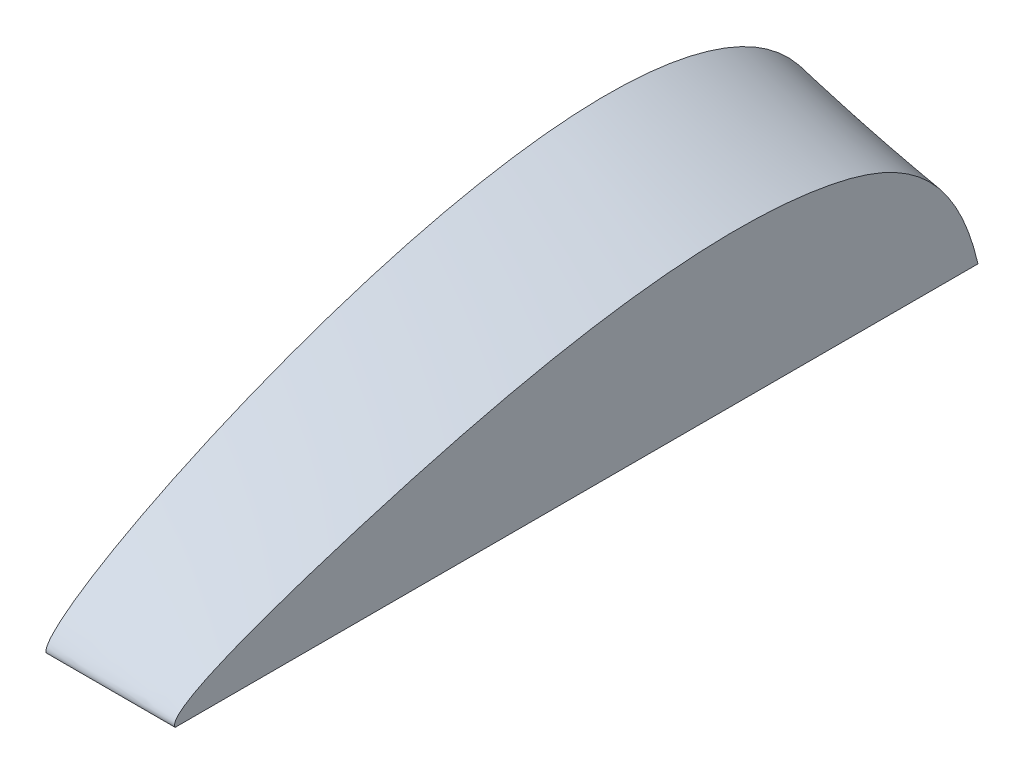
ISO-10303-21;
HEADER;
FILE_DESCRIPTION(('STEP AP214'),'2;1');
FILE_NAME('part.step','',(''),(''),'','','');
FILE_SCHEMA(('AUTOMOTIVE_DESIGN { 1 0 10303 214 1 1 1 1 }'));
ENDSEC;
DATA;
#1=APPLICATION_CONTEXT('core data for automotive mechanical design processes');
#2=APPLICATION_PROTOCOL_DEFINITION('international standard','automotive_design',2000,#1);
#3=PRODUCT_CONTEXT('',#1,'mechanical');
#4=PRODUCT('Part','Part','',(#3));
#5=PRODUCT_RELATED_PRODUCT_CATEGORY('part','',(#4));
#6=PRODUCT_DEFINITION_FORMATION('','',#4);
#7=PRODUCT_DEFINITION_CONTEXT('part definition',#1,'design');
#8=PRODUCT_DEFINITION('design','',#6,#7);
#9=PRODUCT_DEFINITION_SHAPE('','',#8);
#10=(LENGTH_UNIT() NAMED_UNIT(*) SI_UNIT(.MILLI.,.METRE.));
#11=(NAMED_UNIT(*) PLANE_ANGLE_UNIT() SI_UNIT($,.RADIAN.));
#12=(NAMED_UNIT(*) SI_UNIT($,.STERADIAN.) SOLID_ANGLE_UNIT());
#13=UNCERTAINTY_MEASURE_WITH_UNIT(LENGTH_MEASURE(1.E-05),#10,'distance_accuracy_value','');
#14=(GEOMETRIC_REPRESENTATION_CONTEXT(3) GLOBAL_UNCERTAINTY_ASSIGNED_CONTEXT((#13)) GLOBAL_UNIT_ASSIGNED_CONTEXT((#10,
#11,#12)) REPRESENTATION_CONTEXT('',''));
#15=CARTESIAN_POINT('',(0.,0.,0.));
#16=DIRECTION('',(0.,0.,1.));
#17=DIRECTION('',(1.,0.,0.));
#18=AXIS2_PLACEMENT_3D('',#15,#16,#17);
#19=CARTESIAN_POINT('',(45.72,45.4918064139461,11.6264584789723));
#20=DIRECTION('',(1.,0.,0.));
#21=DIRECTION('',(0.,0.,-1.));
#22=AXIS2_PLACEMENT_3D('',#19,#20,#21);
#23=PLANE('',#22);
#24=CARTESIAN_POINT('',(45.72,-3.57791435599524E-13,-142.24));
#25=CARTESIAN_POINT('',(45.72,35.6850060442603,-133.930047255575));
#26=CARTESIAN_POINT('',(45.72,67.099162145114,-72.1826211504353));
#27=CARTESIAN_POINT('',(45.72,33.3645987338918,72.0438580607478));
#28=CARTESIAN_POINT('',(45.72,5.74057061929836,145.252976531255));
#29=CARTESIAN_POINT('',(45.72,0.,142.24));
#30=B_SPLINE_CURVE_WITH_KNOTS('',3,(#24,#25,#26,#27,#28,#29),.UNSPECIFIED.,.F.,.F.,(4,1,1,4),
(0.,0.230277741661509,0.675748620710176,1.),.UNSPECIFIED.);
#31=CARTESIAN_POINT('',(45.72,0.,-142.24));
#32=VERTEX_POINT('',#31);
#33=CARTESIAN_POINT('',(45.72,0.,142.24));
#34=VERTEX_POINT('',#33);
#35=EDGE_CURVE('E44',#32,#34,#30,.T.);
#36=ORIENTED_EDGE('',*,*,#35,.T.);
#37=DIRECTION('',(0.,0.,-1.));
#38=VECTOR('',#37,1.);
#39=CARTESIAN_POINT('',(45.72,0.,142.24));
#40=LINE('',#39,#38);
#41=EDGE_CURVE('E11',#34,#32,#40,.T.);
#42=ORIENTED_EDGE('',*,*,#41,.T.);
#43=EDGE_LOOP('',(#36,#42));
#44=FACE_BOUND('',#43,.T.);
#45=ADVANCED_FACE('F41',(#44),#23,.T.);
#46=CARTESIAN_POINT('',(0.,63.0818745722551,7.9557463435145));
#47=DIRECTION('',(1.,0.,0.));
#48=DIRECTION('',(0.,0.,-1.));
#49=AXIS2_PLACEMENT_3D('',#46,#47,#48);
#50=PLANE('',#49);
#51=CARTESIAN_POINT('',(0.,-2.01841663950931E-13,-142.24));
#52=CARTESIAN_POINT('',(0.,38.6901289092014,-136.736962369235));
#53=CARTESIAN_POINT('',(0.,119.075313211528,-66.6053121241711));
#54=CARTESIAN_POINT('',(0.,14.1329786971291,145.7744150032));
#55=CARTESIAN_POINT('',(0.,0.,142.24));
#56=B_SPLINE_CURVE_WITH_KNOTS('',3,(#51,#52,#53,#54,#55),.UNSPECIFIED.,.F.,.F.,(4,1,4),(0.,
0.218953457440848,1.),.UNSPECIFIED.);
#57=CARTESIAN_POINT('',(0.,0.,-142.24));
#58=VERTEX_POINT('',#57);
#59=CARTESIAN_POINT('',(0.,0.,142.24));
#60=VERTEX_POINT('',#59);
#61=EDGE_CURVE('E72',#58,#60,#56,.T.);
#62=ORIENTED_EDGE('',*,*,#61,.F.);
#63=DIRECTION('',(0.,0.,-1.));
#64=VECTOR('',#63,1.);
#65=CARTESIAN_POINT('',(0.,0.,142.24));
#66=LINE('',#65,#64);
#67=EDGE_CURVE('E70',#60,#58,#66,.T.);
#68=ORIENTED_EDGE('',*,*,#67,.F.);
#69=EDGE_LOOP('',(#62,#68));
#70=FACE_BOUND('',#69,.T.);
#71=ADVANCED_FACE('F71',(#70),#50,.F.);
#72=CARTESIAN_POINT('',(0.,0.,0.));
#73=DIRECTION('',(0.,1.,0.));
#74=DIRECTION('',(0.,0.,1.));
#75=AXIS2_PLACEMENT_3D('',#72,#73,#74);
#76=PLANE('',#75);
#77=DIRECTION('',(1.,0.,0.));
#78=VECTOR('',#77,1.);
#79=CARTESIAN_POINT('',(0.,0.,-142.24));
#80=LINE('',#79,#78);
#81=EDGE_CURVE('E77',#58,#32,#80,.T.);
#82=ORIENTED_EDGE('',*,*,#81,.T.);
#83=ORIENTED_EDGE('',*,*,#41,.F.);
#84=DIRECTION('',(1.,0.,0.));
#85=VECTOR('',#84,1.);
#86=CARTESIAN_POINT('',(0.,0.,142.24));
#87=LINE('',#86,#85);
#88=EDGE_CURVE('E62',#60,#34,#87,.T.);
#89=ORIENTED_EDGE('',*,*,#88,.F.);
#90=ORIENTED_EDGE('',*,*,#67,.T.);
#91=EDGE_LOOP('',(#82,#83,#89,#90));
#92=FACE_BOUND('',#91,.T.);
#93=ADVANCED_FACE('F82',(#92),#76,.F.);
#94=CARTESIAN_POINT('',(0.,-2.01841663950931E-13,-142.24));
#95=CARTESIAN_POINT('',(45.72,-3.57791435599524E-13,-142.24));
#96=CARTESIAN_POINT('',(0.,38.6901289092014,-136.736962369235));
#97=CARTESIAN_POINT('',(45.72,33.9301375626368,-134.338702760267));
#98=CARTESIAN_POINT('',(0.,57.2010476133854,-120.587204331807));
#99=CARTESIAN_POINT('',(45.72,45.8636995407261,-113.92288479983));
#100=CARTESIAN_POINT('',(0.,82.6824346049485,-51.0606341843479));
#101=CARTESIAN_POINT('',(45.72,59.7128628509694,-40.6037348726262));
#102=CARTESIAN_POINT('',(0.,47.5474697582218,77.8784804664242));
#103=CARTESIAN_POINT('',(45.72,33.3645987338918,72.0438580607478));
#104=CARTESIAN_POINT('',(0.,5.86730442593404,143.707311968395));
#105=CARTESIAN_POINT('',(45.72,5.74057061929836,145.252976531255));
#106=CARTESIAN_POINT('',(0.,0.,142.24));
#107=CARTESIAN_POINT('',(45.72,0.,142.24));
#108=B_SPLINE_SURFACE_WITH_KNOTS('',3,1,((#94,#95),(#96,#97),(#98,#99),(#100,#101),(#102,#103),
(#104,#105),(#106,#107)),.UNSPECIFIED.,.F.,.F.,.F.,(4,1,1,1,4),(2,2),(0.,0.218953457440848,
0.230277741661509,0.675748620710176,1.),(0.,1.),.UNSPECIFIED.);
#109=ORIENTED_EDGE('',*,*,#61,.T.);
#110=ORIENTED_EDGE('',*,*,#88,.T.);
#111=ORIENTED_EDGE('',*,*,#35,.F.);
#112=ORIENTED_EDGE('',*,*,#81,.F.);
#113=EDGE_LOOP('',(#109,#110,#111,#112));
#114=FACE_BOUND('',#113,.T.);
#115=ADVANCED_FACE('F79',(#114),#108,.T.);
#116=CLOSED_SHELL('',(#45,#71,#93,#115));
#117=MANIFOLD_SOLID_BREP('B2',#116);
#118=ADVANCED_BREP_SHAPE_REPRESENTATION('',(#18,#117),#14);
#119=SHAPE_DEFINITION_REPRESENTATION(#9,#118);
ENDSEC;
END-ISO-10303-21;
